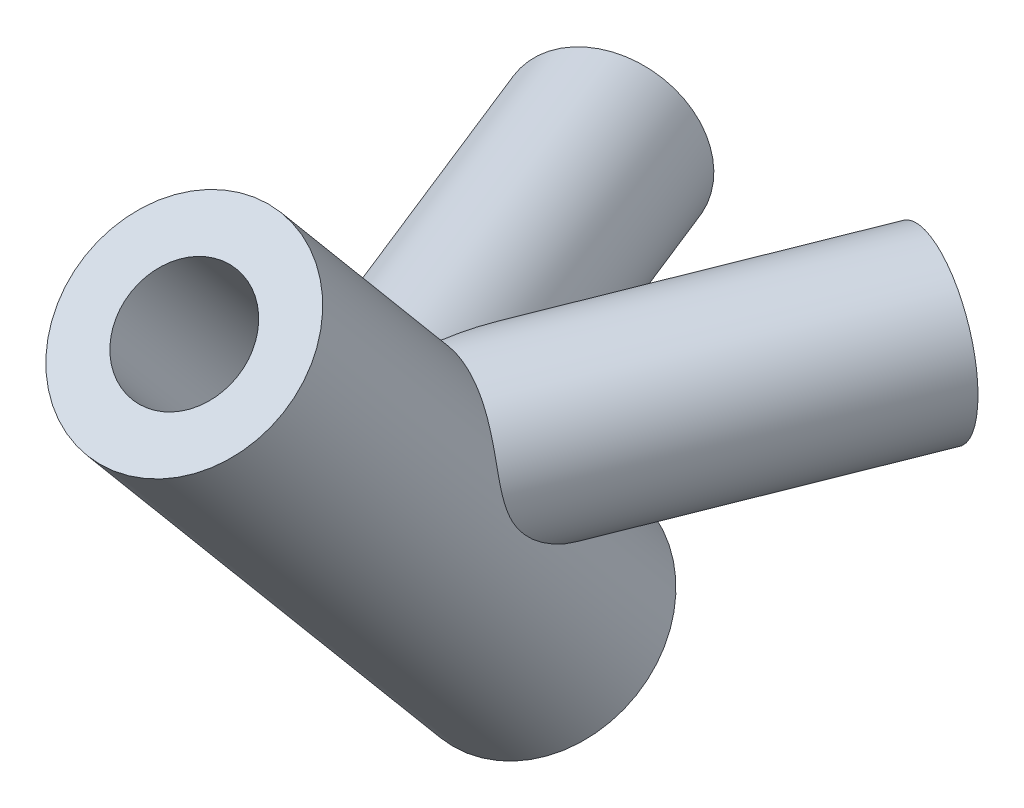
ISO-10303-21;
HEADER;
FILE_DESCRIPTION(('STEP AP214'),'2;1');
FILE_NAME('part.step','',(''),(''),'','','');
FILE_SCHEMA(('AUTOMOTIVE_DESIGN { 1 0 10303 214 1 1 1 1 }'));
ENDSEC;
DATA;
#1=APPLICATION_CONTEXT('core data for automotive mechanical design processes');
#2=APPLICATION_PROTOCOL_DEFINITION('international standard','automotive_design',2000,#1);
#3=PRODUCT_CONTEXT('',#1,'mechanical');
#4=PRODUCT('Part','Part','',(#3));
#5=PRODUCT_RELATED_PRODUCT_CATEGORY('part','',(#4));
#6=PRODUCT_DEFINITION_FORMATION('','',#4);
#7=PRODUCT_DEFINITION_CONTEXT('part definition',#1,'design');
#8=PRODUCT_DEFINITION('design','',#6,#7);
#9=PRODUCT_DEFINITION_SHAPE('','',#8);
#10=(LENGTH_UNIT() NAMED_UNIT(*) SI_UNIT(.MILLI.,.METRE.));
#11=(NAMED_UNIT(*) PLANE_ANGLE_UNIT() SI_UNIT($,.RADIAN.));
#12=(NAMED_UNIT(*) SI_UNIT($,.STERADIAN.) SOLID_ANGLE_UNIT());
#13=UNCERTAINTY_MEASURE_WITH_UNIT(LENGTH_MEASURE(1.E-05),#10,'distance_accuracy_value','');
#14=(GEOMETRIC_REPRESENTATION_CONTEXT(3) GLOBAL_UNCERTAINTY_ASSIGNED_CONTEXT((#13)) GLOBAL_UNIT_ASSIGNED_CONTEXT((#10,
#11,#12)) REPRESENTATION_CONTEXT('',''));
#15=CARTESIAN_POINT('',(0.,0.,0.));
#16=DIRECTION('',(0.,0.,1.));
#17=DIRECTION('',(1.,0.,0.));
#18=AXIS2_PLACEMENT_3D('',#15,#16,#17);
#19=CARTESIAN_POINT('',(0.,9.72876442761101,8.16340264301907));
#20=DIRECTION('',(0.,-0.766044443118977,-0.64278760968654));
#21=DIRECTION('',(0.,0.642787609686541,-0.766044443118977));
#22=AXIS2_PLACEMENT_3D('',#19,#20,#21);
#23=CYLINDRICAL_SURFACE('',#22,5.08);
#24=CARTESIAN_POINT('',(0.,9.72876442761101,8.16340264301907));
#25=DIRECTION('',(0.,0.766044443118977,0.642787609686541));
#26=DIRECTION('',(0.,-0.64278760968654,0.766044443118977));
#27=AXIS2_PLACEMENT_3D('',#24,#25,#26);
#28=CIRCLE('',#27,5.08);
#29=CARTESIAN_POINT('',(0.,6.46340337040338,12.0549084140635));
#30=VERTEX_POINT('',#29);
#31=EDGE_CURVE('E63',#30,#30,#28,.T.);
#32=ORIENTED_EDGE('',*,*,#31,.F.);
#33=EDGE_LOOP('',(#32));
#34=FACE_BOUND('',#33,.T.);
#35=CARTESIAN_POINT('',(0.,-9.72876442761101,-8.16340264301907));
#36=DIRECTION('',(0.,0.766044443118977,0.642787609686541));
#37=DIRECTION('',(0.,-0.64278760968654,0.766044443118977));
#38=AXIS2_PLACEMENT_3D('',#35,#36,#37);
#39=CIRCLE('',#38,5.08);
#40=CARTESIAN_POINT('',(0.,-12.9941254848186,-4.27189687197466));
#41=VERTEX_POINT('',#40);
#42=EDGE_CURVE('E65',#41,#41,#39,.T.);
#43=ORIENTED_EDGE('',*,*,#42,.T.);
#44=EDGE_LOOP('',(#43));
#45=FACE_BOUND('',#44,.T.);
#46=CARTESIAN_POINT('',(0.,3.56427048720662,-3.64069097857684));
#47=CARTESIAN_POINT('',(0.16761632511121,3.49764291027974,-3.6965856682746));
#48=CARTESIAN_POINT('',(0.330069031246083,3.41782441855342,-3.75266208100743));
#49=CARTESIAN_POINT('',(0.638847500080253,3.23341545850555,-3.86877450230432));
#50=CARTESIAN_POINT('',(0.785176534116976,3.12883002876736,-3.92880970370268));
#51=CARTESIAN_POINT('',(0.988139709791364,2.95524515583655,-4.02569412106894));
#52=CARTESIAN_POINT('',(1.05330680143077,2.89427116340931,-4.05930255603205));
#53=CARTESIAN_POINT('',(1.17695142475785,2.76742759324789,-4.12941566518185));
#54=CARTESIAN_POINT('',(1.23543252316153,2.7015606569407,-4.16591877740223));
#55=CARTESIAN_POINT('',(1.34476996749405,2.5658205886225,-4.24234317168568));
#56=CARTESIAN_POINT('',(1.39563889794891,2.49595433878226,-4.28225863679349));
#57=CARTESIAN_POINT('',(1.48914968269413,2.35311276567645,-4.36596982615417));
#58=CARTESIAN_POINT('',(1.53179291286081,2.28013796486168,-4.40976489969077));
#59=CARTESIAN_POINT('',(1.60389943060631,2.14091766568274,-4.49599570185458));
#60=CARTESIAN_POINT('',(1.63432332980496,2.07489134040598,-4.53798448749133));
#61=CARTESIAN_POINT('',(1.68837736605173,1.94206438963902,-4.62501673338684));
#62=CARTESIAN_POINT('',(1.71200507359926,1.87526349611197,-4.67006127892398));
#63=CARTESIAN_POINT('',(1.77288233769618,1.67474835826423,-4.80950793568409));
#64=CARTESIAN_POINT('',(1.80014024246453,1.54089349114991,-4.90824026905383));
#65=CARTESIAN_POINT('',(1.82646556799219,1.3180651135138,-5.08203990446647));
#66=CARTESIAN_POINT('',(1.8316418893075,1.22800603917018,-5.15499048875784));
#67=CARTESIAN_POINT('',(1.83236717186197,1.0502217881172,-5.3038063699623));
#68=CARTESIAN_POINT('',(1.82791168265462,0.962497709267862,-5.37967299834555));
#69=CARTESIAN_POINT('',(1.81070162388344,0.789381489991564,-5.53354989532939));
#70=CARTESIAN_POINT('',(1.79792263812685,0.703996982792391,-5.61156582183744));
#71=CARTESIAN_POINT('',(1.76522653471901,0.535689859322771,-5.76877570125691));
#72=CARTESIAN_POINT('',(1.74530649804846,0.452768264838925,-5.84797012319019));
#73=CARTESIAN_POINT('',(1.67975138334418,0.219641848444542,-6.07442627201377));
#74=CARTESIAN_POINT('',(1.62665015330616,0.0721517697367563,-6.22233208526182));
#75=CARTESIAN_POINT('',(1.50349329944941,-0.21690754858125,-6.51694579779598));
#76=CARTESIAN_POINT('',(1.43342169723442,-0.358471059846143,-6.66365243262663));
#77=CARTESIAN_POINT('',(1.27846382255,-0.637306922676255,-6.95365363937045));
#78=CARTESIAN_POINT('',(1.19355880943171,-0.774573583736182,-7.09694363124561));
#79=CARTESIAN_POINT('',(1.01005107923469,-1.04570704711363,-7.37767874578381));
#80=CARTESIAN_POINT('',(0.911456588659131,-1.17957583461177,-7.51512731445784));
#81=CARTESIAN_POINT('',(0.729603983356677,-1.40827845566384,-7.74518098992566));
#82=CARTESIAN_POINT('',(0.649575286152909,-1.503731332992,-7.83973084152228));
#83=CARTESIAN_POINT('',(0.482143562179067,-1.69339276195728,-8.0233750684913));
#84=CARTESIAN_POINT('',(0.394742158131474,-1.78760158215761,-8.11247063693241));
#85=CARTESIAN_POINT('',(0.212422708440739,-1.97453190920489,-8.28356812790652));
#86=CARTESIAN_POINT('',(0.117525496692644,-2.06725673297127,-8.36558847247321));
#87=CARTESIAN_POINT('',(-0.0804530086145272,-2.2512020550591,-8.52087847155734));
#88=CARTESIAN_POINT('',(-0.183529329466784,-2.34242342731016,-8.59415337625373));
#89=CARTESIAN_POINT('',(-0.412572935215546,-2.53469277416725,-8.73833682526642));
#90=CARTESIAN_POINT('',(-0.539771767505752,-2.63546852610447,-8.80768702306375));
#91=CARTESIAN_POINT('',(-0.806183430585438,-2.83290434906498,-8.92686416309001));
#92=CARTESIAN_POINT('',(-0.945386248335596,-2.92956775175347,-8.97670718848602));
#93=CARTESIAN_POINT('',(-1.20233201878175,-3.09442865518352,-9.04132264152199));
#94=CARTESIAN_POINT('',(-1.31773357409339,-3.16409220129734,-9.06149951656311));
#95=CARTESIAN_POINT('',(-1.55407370438321,-3.29668453652411,-9.081820557187));
#96=CARTESIAN_POINT('',(-1.67500229690182,-3.35962483173114,-9.08199951407757));
#97=CARTESIAN_POINT('',(-1.89856707875977,-3.46584435181048,-9.06074283176162));
#98=CARTESIAN_POINT('',(-2.00081593861562,-3.51064681588807,-9.04297858020276));
#99=CARTESIAN_POINT('',(-2.20425958046213,-3.5916926588718,-8.99022899195637));
#100=CARTESIAN_POINT('',(-2.30545500515478,-3.62794158919032,-8.95525487054963));
#101=CARTESIAN_POINT('',(-2.50373932718494,-3.69063278397929,-8.86877054008669));
#102=CARTESIAN_POINT('',(-2.60082743221682,-3.71707316394485,-8.81725715690511));
#103=CARTESIAN_POINT('',(-2.78838270731828,-3.75986014751547,-8.6999748238019));
#104=CARTESIAN_POINT('',(-2.87884431560533,-3.77619835578513,-8.63419407824511));
#105=CARTESIAN_POINT('',(-3.07883517194429,-3.80298390695502,-8.46898667451247));
#106=CARTESIAN_POINT('',(-3.18543564672345,-3.80997198026477,-8.36548028072927));
#107=CARTESIAN_POINT('',(-3.38429476021183,-3.81002801152785,-8.14551217233178));
#108=CARTESIAN_POINT('',(-3.47652241844272,-3.80306633626894,-8.02902337584711));
#109=CARTESIAN_POINT('',(-3.6302917969438,-3.78039197044922,-7.81257093669015));
#110=CARTESIAN_POINT('',(-3.69425921960649,-3.7667476166123,-7.71406637317918));
#111=CARTESIAN_POINT('',(-3.81470896546287,-3.73334652056141,-7.51353035917504));
#112=CARTESIAN_POINT('',(-3.87118655308791,-3.71358593733501,-7.41149672828301));
#113=CARTESIAN_POINT('',(-3.97756389927971,-3.66878007804198,-7.20496642212007));
#114=CARTESIAN_POINT('',(-4.02745071593383,-3.64372464828299,-7.10046536218049));
#115=CARTESIAN_POINT('',(-4.12131176994363,-3.58900134010067,-6.8900083845094));
#116=CARTESIAN_POINT('',(-4.16528381258804,-3.55933175832584,-6.78405194273405));
#117=CARTESIAN_POINT('',(-4.28157547962851,-3.47012914024063,-6.48498216187388));
#118=CARTESIAN_POINT('',(-4.34793228647167,-3.40590448482839,-6.29093619784359));
#119=CARTESIAN_POINT('',(-4.46675151442775,-3.26578340185544,-5.90274074810358));
#120=CARTESIAN_POINT('',(-4.51920150220136,-3.18987662510382,-5.70859132421863));
#121=CARTESIAN_POINT('',(-4.61263644638605,-3.02700383697113,-5.32183808153621));
#122=CARTESIAN_POINT('',(-4.6536034449995,-2.94002080937342,-5.12923713613935));
#123=CARTESIAN_POINT('',(-4.72578153219212,-2.7549872572948,-4.7476779823904));
#124=CARTESIAN_POINT('',(-4.75699779101735,-2.65694263579945,-4.55871789355216));
#125=CARTESIAN_POINT('',(-4.80336657358479,-2.47840683898259,-4.23942713386699));
#126=CARTESIAN_POINT('',(-4.82056183063545,-2.40087417811644,-4.10773225400612));
#127=CARTESIAN_POINT('',(-4.85105538102364,-2.23891904367587,-3.84812784533511));
#128=CARTESIAN_POINT('',(-4.86435303075764,-2.15449543515331,-3.72021894482707));
#129=CARTESIAN_POINT('',(-4.88727740061571,-1.9780662202424,-3.46983850758317));
#130=CARTESIAN_POINT('',(-4.89691342972405,-1.88608057382607,-3.347353891382));
#131=CARTESIAN_POINT('',(-4.9126437687274,-1.69326435045888,-3.10940901070616));
#132=CARTESIAN_POINT('',(-4.91874009041954,-1.59243883524038,-2.99394478965768));
#133=CARTESIAN_POINT('',(-4.92826080496291,-1.35564077366609,-2.74649430605385));
#134=CARTESIAN_POINT('',(-4.93072563195682,-1.21696576724277,-2.61696780549873));
#135=CARTESIAN_POINT('',(-4.92935110948138,-0.996141023174749,-2.43884254340127));
#136=CARTESIAN_POINT('',(-4.92804974202792,-0.920442404730753,-2.38218817432902));
#137=CARTESIAN_POINT('',(-4.9234794196721,-0.764763819443768,-2.27521334926329));
#138=CARTESIAN_POINT('',(-4.9202108468772,-0.68478468679032,-2.22489166551164));
#139=CARTESIAN_POINT('',(-4.90824679189373,-0.462961735496123,-2.09874675279465));
#140=CARTESIAN_POINT('',(-4.89735156819058,-0.317152373019538,-2.02986440334737));
#141=CARTESIAN_POINT('',(-4.86667772606281,-0.017052339324615,-1.91718872655812));
#142=CARTESIAN_POINT('',(-4.84690232985261,0.137235237725805,-1.87338631194232));
#143=CARTESIAN_POINT('',(-4.79626238730912,0.448795351261694,-1.81115377013919));
#144=CARTESIAN_POINT('',(-4.76541238272529,0.606063718448969,-1.79269052344007));
#145=CARTESIAN_POINT('',(-4.69089087439187,0.918622131710084,-1.77800921590877));
#146=CARTESIAN_POINT('',(-4.64720559019626,1.07390986335394,-1.78181514761821));
#147=CARTESIAN_POINT('',(-4.54308052858457,1.38700343243921,-1.80796560547416));
#148=CARTESIAN_POINT('',(-4.48182590512547,1.54444598019484,-1.83135719434491));
#149=CARTESIAN_POINT('',(-4.34327885878129,1.84901149204575,-1.89286960547418));
#150=CARTESIAN_POINT('',(-4.26598137328711,1.99613117892232,-1.93099508055306));
#151=CARTESIAN_POINT('',(-4.07968891079128,2.30326057977057,-2.02555856913115));
#152=CARTESIAN_POINT('',(-3.96748098403281,2.46069108490056,-2.08407218026218));
#153=CARTESIAN_POINT('',(-3.72145996680467,2.7538359287717,-2.2099155470816));
#154=CARTESIAN_POINT('',(-3.58763731869919,2.88954060764712,-2.27724920033094));
#155=CARTESIAN_POINT('',(-3.36766592207544,3.07828632281304,-2.38376156911835));
#156=CARTESIAN_POINT('',(-3.28838257184971,3.14036756007629,-2.42142912789593));
#157=CARTESIAN_POINT('',(-3.12474299527782,3.25694359467775,-2.49744906576059));
#158=CARTESIAN_POINT('',(-3.04038847974719,3.3114409301925,-2.5358012108587));
#159=CARTESIAN_POINT('',(-2.86709093839297,3.41246052304508,-2.6127141366689));
#160=CARTESIAN_POINT('',(-2.77814658917365,3.45898046334104,-2.6512749746526));
#161=CARTESIAN_POINT('',(-2.59631783592292,3.5436642826665,-2.72816995810564));
#162=CARTESIAN_POINT('',(-2.50343502168504,3.58183149572439,-2.76650418805981));
#163=CARTESIAN_POINT('',(-2.31561273156805,3.64909648083487,-2.84211829483337));
#164=CARTESIAN_POINT('',(-2.22071672425418,3.67830756354377,-2.87940541100555));
#165=CARTESIAN_POINT('',(-2.02843054070856,3.72811783822952,-2.95318013229806));
#166=CARTESIAN_POINT('',(-1.93104130245711,3.74872021979725,-2.98966802877896));
#167=CARTESIAN_POINT('',(-1.73441567525173,3.78119768529318,-3.06170664285949));
#168=CARTESIAN_POINT('',(-1.63517829699291,3.7930679487317,-3.09725683238213));
#169=CARTESIAN_POINT('',(-1.43571307603345,3.80798905525713,-3.16729913955075));
#170=CARTESIAN_POINT('',(-1.33548557808068,3.81104286656592,-3.20179160942739));
#171=CARTESIAN_POINT('',(-1.13018728936775,3.80826972090689,-3.27129412439319));
#172=CARTESIAN_POINT('',(-1.02510534418775,3.80202871880067,-3.30625526170876));
#173=CARTESIAN_POINT('',(-0.815653840396229,3.77996478417284,-3.37513970341342));
#174=CARTESIAN_POINT('',(-0.711284052235908,3.76414510252511,-3.40906335580921));
#175=CARTESIAN_POINT('',(-0.50414650809748,3.72304237478817,-3.47613286943978));
#176=CARTESIAN_POINT('',(-0.401378994549176,3.69775791084363,-3.50927861335035));
#177=CARTESIAN_POINT('',(-0.198481936467768,3.63791887221502,-3.57515900746108));
#178=CARTESIAN_POINT('',(-0.0983520568730617,3.60336548127046,-3.60789370959717));
#179=CARTESIAN_POINT('',(0.,3.56427048720662,-3.64069097857684));
#180=B_SPLINE_CURVE_WITH_KNOTS('',3,(#46,#47,#48,#49,#50,#51,#52,#53,#54,#55,#56,#57,#58,#59,
#60,#61,#62,#63,#64,#65,#66,#67,#68,#69,#70,#71,#72,#73,#74,#75,#76,#77,#78,#79,#80,#81,#82,#83,
#84,#85,#86,#87,#88,#89,#90,#91,#92,#93,#94,#95,#96,#97,#98,#99,#100,#101,#102,#103,#104,#105,
#106,#107,#108,#109,#110,#111,#112,#113,#114,#115,#116,#117,#118,#119,#120,#121,#122,#123,#124,
#125,#126,#127,#128,#129,#130,#131,#132,#133,#134,#135,#136,#137,#138,#139,#140,#141,#142,#143,
#144,#145,#146,#147,#148,#149,#150,#151,#152,#153,#154,#155,#156,#157,#158,#159,#160,#161,#162,
#163,#164,#165,#166,#167,#168,#169,#170,#171,#172,#173,#174,#175,#176,#177,#178,#179),
.UNSPECIFIED.,.T.,.F.,(4,2,2,2,2,2,2,2,2,2,2,2,2,2,2,2,2,2,2,2,2,2,2,2,2,2,2,2,2,2,2,2,2,2,2,2,
2,2,2,2,2,2,2,2,2,2,2,2,2,2,2,2,2,2,2,2,2,2,2,2,2,2,2,2,2,2,4),(0.,0.566202143962359,
1.13228919862481,1.41804266523583,1.70364297514943,1.9887657833072,2.27384085880712,
2.52535520819528,2.77695935743235,3.28006134716035,3.62767586045955,3.9754510258445,
4.32425097946361,4.67319367354898,5.31871224614298,5.96484098372955,6.6117920280634,
7.25835596529789,7.72726931941327,8.19607973430549,8.66363012432426,9.13089840116587,
9.65918097859601,10.1870270782853,10.5945503099163,11.0013645433801,11.3389811329889,
11.676377996343,12.0138396498162,12.3515813727028,12.7953458871295,13.2400540822836,
13.594294623248,13.9487580813833,14.3039075488012,14.659188435097,15.3028612709894,
15.947107654391,16.5923559987357,17.2372616226073,17.6984099955537,18.1596344740964,
18.6196784033491,19.0794606094732,19.6468754801572,19.9302723700682,20.213614231087,
20.696139389078,21.1784896017354,21.6602087570894,22.1424470062912,22.6522455095038,
23.1622051339333,23.7656265974852,24.3693156171795,24.6915207447949,25.0136177762705,
25.335808203253,25.6578697909726,25.9756704051936,26.2933531671787,26.6112111718257,
26.9289621512028,27.2612973481539,27.5935198182192,27.9257920762263,28.2580219197555),.UNSPECIFIED.);
#181=CARTESIAN_POINT('',(0.,-2.1763987439394,-8.45768441314223));
#182=VERTEX_POINT('',#181);
#183=CARTESIAN_POINT('',(0.,3.56427048720662,-3.64069097857684));
#184=VERTEX_POINT('',#183);
#185=EDGE_CURVE('E47',#182,#184,#180,.T.);
#186=ORIENTED_EDGE('',*,*,#185,.F.);
#187=CARTESIAN_POINT('',(0.,3.56427048720662,-3.64069097857684));
#188=CARTESIAN_POINT('',(-0.16761632511121,3.49764291027974,-3.6965856682746));
#189=CARTESIAN_POINT('',(-0.330069031246083,3.41782441855342,-3.75266208100743));
#190=CARTESIAN_POINT('',(-0.638847500080253,3.23341545850555,-3.86877450230432));
#191=CARTESIAN_POINT('',(-0.785176534116976,3.12883002876736,-3.92880970370268));
#192=CARTESIAN_POINT('',(-0.988139709791364,2.95524515583655,-4.02569412106894));
#193=CARTESIAN_POINT('',(-1.05330680143077,2.89427116340931,-4.05930255603205));
#194=CARTESIAN_POINT('',(-1.17695142475785,2.76742759324789,-4.12941566518185));
#195=CARTESIAN_POINT('',(-1.23543252316153,2.7015606569407,-4.16591877740223));
#196=CARTESIAN_POINT('',(-1.34476996749405,2.5658205886225,-4.24234317168568));
#197=CARTESIAN_POINT('',(-1.39563889794891,2.49595433878226,-4.28225863679349));
#198=CARTESIAN_POINT('',(-1.48914968269413,2.35311276567645,-4.36596982615417));
#199=CARTESIAN_POINT('',(-1.53179291286081,2.28013796486168,-4.40976489969077));
#200=CARTESIAN_POINT('',(-1.60389943060631,2.14091766568274,-4.49599570185458));
#201=CARTESIAN_POINT('',(-1.63432332980496,2.07489134040598,-4.53798448749133));
#202=CARTESIAN_POINT('',(-1.68837736605173,1.94206438963902,-4.62501673338684));
#203=CARTESIAN_POINT('',(-1.71200507359926,1.87526349611197,-4.67006127892398));
#204=CARTESIAN_POINT('',(-1.77288233769618,1.67474835826423,-4.80950793568409));
#205=CARTESIAN_POINT('',(-1.80014024246453,1.54089349114991,-4.90824026905383));
#206=CARTESIAN_POINT('',(-1.82646556799219,1.3180651135138,-5.08203990446647));
#207=CARTESIAN_POINT('',(-1.8316418893075,1.22800603917018,-5.15499048875784));
#208=CARTESIAN_POINT('',(-1.83236717186197,1.0502217881172,-5.3038063699623));
#209=CARTESIAN_POINT('',(-1.82791168265462,0.962497709267862,-5.37967299834555));
#210=CARTESIAN_POINT('',(-1.81070162388344,0.789381489991564,-5.53354989532939));
#211=CARTESIAN_POINT('',(-1.79792263812685,0.703996982792391,-5.61156582183744));
#212=CARTESIAN_POINT('',(-1.76522653471901,0.535689859322771,-5.76877570125691));
#213=CARTESIAN_POINT('',(-1.74530649804846,0.452768264838925,-5.84797012319019));
#214=CARTESIAN_POINT('',(-1.67975138334418,0.219641848444542,-6.07442627201377));
#215=CARTESIAN_POINT('',(-1.62665015330616,0.0721517697367563,-6.22233208526182));
#216=CARTESIAN_POINT('',(-1.50349329944941,-0.21690754858125,-6.51694579779598));
#217=CARTESIAN_POINT('',(-1.43342169723442,-0.358471059846143,-6.66365243262663));
#218=CARTESIAN_POINT('',(-1.27846382255,-0.637306922676255,-6.95365363937045));
#219=CARTESIAN_POINT('',(-1.19355880943171,-0.774573583736182,-7.09694363124561));
#220=CARTESIAN_POINT('',(-1.01005107923469,-1.04570704711363,-7.37767874578381));
#221=CARTESIAN_POINT('',(-0.911456588659131,-1.17957583461177,-7.51512731445784));
#222=CARTESIAN_POINT('',(-0.729603983356677,-1.40827845566384,-7.74518098992566));
#223=CARTESIAN_POINT('',(-0.649575286152909,-1.503731332992,-7.83973084152228));
#224=CARTESIAN_POINT('',(-0.482143562179067,-1.69339276195728,-8.0233750684913));
#225=CARTESIAN_POINT('',(-0.394742158131474,-1.78760158215761,-8.11247063693241));
#226=CARTESIAN_POINT('',(-0.212422708440739,-1.97453190920489,-8.28356812790652));
#227=CARTESIAN_POINT('',(-0.117525496692644,-2.06725673297127,-8.36558847247321));
#228=CARTESIAN_POINT('',(0.0804530086145272,-2.2512020550591,-8.52087847155734));
#229=CARTESIAN_POINT('',(0.183529329466784,-2.34242342731016,-8.59415337625373));
#230=CARTESIAN_POINT('',(0.412572935215546,-2.53469277416725,-8.73833682526642));
#231=CARTESIAN_POINT('',(0.539771767505752,-2.63546852610447,-8.80768702306375));
#232=CARTESIAN_POINT('',(0.806183430585438,-2.83290434906498,-8.92686416309001));
#233=CARTESIAN_POINT('',(0.945386248335596,-2.92956775175347,-8.97670718848602));
#234=CARTESIAN_POINT('',(1.20233201878175,-3.09442865518352,-9.04132264152199));
#235=CARTESIAN_POINT('',(1.31773357409339,-3.16409220129734,-9.06149951656311));
#236=CARTESIAN_POINT('',(1.55407370438321,-3.29668453652411,-9.081820557187));
#237=CARTESIAN_POINT('',(1.67500229690182,-3.35962483173114,-9.08199951407757));
#238=CARTESIAN_POINT('',(1.89856707875977,-3.46584435181048,-9.06074283176162));
#239=CARTESIAN_POINT('',(2.00081593861562,-3.51064681588807,-9.04297858020276));
#240=CARTESIAN_POINT('',(2.20425958046213,-3.5916926588718,-8.99022899195637));
#241=CARTESIAN_POINT('',(2.30545500515478,-3.62794158919032,-8.95525487054963));
#242=CARTESIAN_POINT('',(2.50373932718494,-3.69063278397929,-8.86877054008669));
#243=CARTESIAN_POINT('',(2.60082743221682,-3.71707316394485,-8.81725715690511));
#244=CARTESIAN_POINT('',(2.78838270731828,-3.75986014751547,-8.6999748238019));
#245=CARTESIAN_POINT('',(2.87884431560533,-3.77619835578513,-8.63419407824511));
#246=CARTESIAN_POINT('',(3.07883517194429,-3.80298390695502,-8.46898667451247));
#247=CARTESIAN_POINT('',(3.18543564672345,-3.80997198026477,-8.36548028072927));
#248=CARTESIAN_POINT('',(3.38429476021183,-3.81002801152785,-8.14551217233178));
#249=CARTESIAN_POINT('',(3.47652241844272,-3.80306633626894,-8.02902337584711));
#250=CARTESIAN_POINT('',(3.6302917969438,-3.78039197044922,-7.81257093669015));
#251=CARTESIAN_POINT('',(3.69425921960649,-3.7667476166123,-7.71406637317918));
#252=CARTESIAN_POINT('',(3.81470896546287,-3.73334652056141,-7.51353035917504));
#253=CARTESIAN_POINT('',(3.87118655308791,-3.71358593733501,-7.41149672828301));
#254=CARTESIAN_POINT('',(3.97756389927971,-3.66878007804198,-7.20496642212007));
#255=CARTESIAN_POINT('',(4.02745071593383,-3.64372464828299,-7.10046536218049));
#256=CARTESIAN_POINT('',(4.12131176994363,-3.58900134010067,-6.8900083845094));
#257=CARTESIAN_POINT('',(4.16528381258804,-3.55933175832584,-6.78405194273405));
#258=CARTESIAN_POINT('',(4.28157547962851,-3.47012914024063,-6.48498216187388));
#259=CARTESIAN_POINT('',(4.34793228647167,-3.40590448482839,-6.29093619784359));
#260=CARTESIAN_POINT('',(4.46675151442775,-3.26578340185544,-5.90274074810358));
#261=CARTESIAN_POINT('',(4.51920150220136,-3.18987662510382,-5.70859132421863));
#262=CARTESIAN_POINT('',(4.61263644638605,-3.02700383697113,-5.32183808153621));
#263=CARTESIAN_POINT('',(4.6536034449995,-2.94002080937342,-5.12923713613935));
#264=CARTESIAN_POINT('',(4.72578153219212,-2.7549872572948,-4.7476779823904));
#265=CARTESIAN_POINT('',(4.75699779101735,-2.65694263579945,-4.55871789355216));
#266=CARTESIAN_POINT('',(4.80336657358479,-2.47840683898259,-4.23942713386699));
#267=CARTESIAN_POINT('',(4.82056183063545,-2.40087417811644,-4.10773225400612));
#268=CARTESIAN_POINT('',(4.85105538102364,-2.23891904367587,-3.84812784533511));
#269=CARTESIAN_POINT('',(4.86435303075764,-2.15449543515331,-3.72021894482707));
#270=CARTESIAN_POINT('',(4.88727740061571,-1.9780662202424,-3.46983850758317));
#271=CARTESIAN_POINT('',(4.89691342972405,-1.88608057382607,-3.347353891382));
#272=CARTESIAN_POINT('',(4.9126437687274,-1.69326435045888,-3.10940901070616));
#273=CARTESIAN_POINT('',(4.91874009041954,-1.59243883524038,-2.99394478965768));
#274=CARTESIAN_POINT('',(4.92826080496291,-1.35564077366609,-2.74649430605385));
#275=CARTESIAN_POINT('',(4.93072563195682,-1.21696576724277,-2.61696780549873));
#276=CARTESIAN_POINT('',(4.92935110948138,-0.996141023174749,-2.43884254340127));
#277=CARTESIAN_POINT('',(4.92804974202792,-0.920442404730753,-2.38218817432902));
#278=CARTESIAN_POINT('',(4.9234794196721,-0.764763819443768,-2.27521334926329));
#279=CARTESIAN_POINT('',(4.9202108468772,-0.68478468679032,-2.22489166551164));
#280=CARTESIAN_POINT('',(4.90824679189373,-0.462961735496123,-2.09874675279465));
#281=CARTESIAN_POINT('',(4.89735156819058,-0.317152373019538,-2.02986440334737));
#282=CARTESIAN_POINT('',(4.86667772606281,-0.017052339324615,-1.91718872655812));
#283=CARTESIAN_POINT('',(4.84690232985261,0.137235237725805,-1.87338631194232));
#284=CARTESIAN_POINT('',(4.79626238730912,0.448795351261694,-1.81115377013919));
#285=CARTESIAN_POINT('',(4.76541238272529,0.606063718448969,-1.79269052344007));
#286=CARTESIAN_POINT('',(4.69089087439187,0.918622131710084,-1.77800921590877));
#287=CARTESIAN_POINT('',(4.64720559019626,1.07390986335394,-1.78181514761821));
#288=CARTESIAN_POINT('',(4.54308052858457,1.38700343243921,-1.80796560547416));
#289=CARTESIAN_POINT('',(4.48182590512547,1.54444598019484,-1.83135719434491));
#290=CARTESIAN_POINT('',(4.34327885878129,1.84901149204575,-1.89286960547418));
#291=CARTESIAN_POINT('',(4.26598137328711,1.99613117892232,-1.93099508055306));
#292=CARTESIAN_POINT('',(4.07968891079128,2.30326057977057,-2.02555856913115));
#293=CARTESIAN_POINT('',(3.96748098403281,2.46069108490056,-2.08407218026218));
#294=CARTESIAN_POINT('',(3.72145996680467,2.7538359287717,-2.2099155470816));
#295=CARTESIAN_POINT('',(3.58763731869919,2.88954060764712,-2.27724920033094));
#296=CARTESIAN_POINT('',(3.36766592207544,3.07828632281304,-2.38376156911835));
#297=CARTESIAN_POINT('',(3.28838257184971,3.14036756007629,-2.42142912789593));
#298=CARTESIAN_POINT('',(3.12474299527782,3.25694359467775,-2.49744906576059));
#299=CARTESIAN_POINT('',(3.04038847974719,3.3114409301925,-2.5358012108587));
#300=CARTESIAN_POINT('',(2.86709093839297,3.41246052304508,-2.6127141366689));
#301=CARTESIAN_POINT('',(2.77814658917365,3.45898046334104,-2.6512749746526));
#302=CARTESIAN_POINT('',(2.59631783592292,3.5436642826665,-2.72816995810564));
#303=CARTESIAN_POINT('',(2.50343502168504,3.58183149572439,-2.76650418805981));
#304=CARTESIAN_POINT('',(2.31561273156805,3.64909648083487,-2.84211829483337));
#305=CARTESIAN_POINT('',(2.22071672425418,3.67830756354377,-2.87940541100555));
#306=CARTESIAN_POINT('',(2.02843054070856,3.72811783822952,-2.95318013229806));
#307=CARTESIAN_POINT('',(1.93104130245711,3.74872021979725,-2.98966802877896));
#308=CARTESIAN_POINT('',(1.73441567525173,3.78119768529318,-3.06170664285949));
#309=CARTESIAN_POINT('',(1.63517829699291,3.7930679487317,-3.09725683238213));
#310=CARTESIAN_POINT('',(1.43571307603345,3.80798905525713,-3.16729913955075));
#311=CARTESIAN_POINT('',(1.33548557808068,3.81104286656592,-3.20179160942739));
#312=CARTESIAN_POINT('',(1.13018728936775,3.80826972090689,-3.27129412439319));
#313=CARTESIAN_POINT('',(1.02510534418775,3.80202871880067,-3.30625526170876));
#314=CARTESIAN_POINT('',(0.815653840396229,3.77996478417284,-3.37513970341342));
#315=CARTESIAN_POINT('',(0.711284052235908,3.76414510252511,-3.40906335580921));
#316=CARTESIAN_POINT('',(0.50414650809748,3.72304237478817,-3.47613286943978));
#317=CARTESIAN_POINT('',(0.401378994549176,3.69775791084363,-3.50927861335035));
#318=CARTESIAN_POINT('',(0.198481936467768,3.63791887221502,-3.57515900746108));
#319=CARTESIAN_POINT('',(0.0983520568730617,3.60336548127046,-3.60789370959717));
#320=CARTESIAN_POINT('',(0.,3.56427048720662,-3.64069097857684));
#321=B_SPLINE_CURVE_WITH_KNOTS('',3,(#187,#188,#189,#190,#191,#192,#193,#194,#195,#196,#197,
#198,#199,#200,#201,#202,#203,#204,#205,#206,#207,#208,#209,#210,#211,#212,#213,#214,#215,#216,
#217,#218,#219,#220,#221,#222,#223,#224,#225,#226,#227,#228,#229,#230,#231,#232,#233,#234,#235,
#236,#237,#238,#239,#240,#241,#242,#243,#244,#245,#246,#247,#248,#249,#250,#251,#252,#253,#254,
#255,#256,#257,#258,#259,#260,#261,#262,#263,#264,#265,#266,#267,#268,#269,#270,#271,#272,#273,
#274,#275,#276,#277,#278,#279,#280,#281,#282,#283,#284,#285,#286,#287,#288,#289,#290,#291,#292,
#293,#294,#295,#296,#297,#298,#299,#300,#301,#302,#303,#304,#305,#306,#307,#308,#309,#310,#311,
#312,#313,#314,#315,#316,#317,#318,#319,#320),.UNSPECIFIED.,.T.,.F.,(4,2,2,2,2,2,2,2,2,2,2,2,2,
2,2,2,2,2,2,2,2,2,2,2,2,2,2,2,2,2,2,2,2,2,2,2,2,2,2,2,2,2,2,2,2,2,2,2,2,2,2,2,2,2,2,2,2,2,2,2,2,
2,2,2,2,2,4),(0.,0.566202143962359,1.13228919862481,1.41804266523583,1.70364297514943,
1.9887657833072,2.27384085880712,2.52535520819528,2.77695935743235,3.28006134716035,
3.62767586045955,3.9754510258445,4.32425097946361,4.67319367354898,5.31871224614298,
5.96484098372955,6.6117920280634,7.25835596529789,7.72726931941327,8.19607973430549,
8.66363012432426,9.13089840116587,9.65918097859601,10.1870270782853,10.5945503099163,
11.0013645433801,11.3389811329889,11.676377996343,12.0138396498162,12.3515813727028,
12.7953458871295,13.2400540822836,13.594294623248,13.9487580813833,14.3039075488012,
14.659188435097,15.3028612709894,15.947107654391,16.5923559987357,17.2372616226073,
17.6984099955537,18.1596344740964,18.6196784033491,19.0794606094732,19.6468754801572,
19.9302723700682,20.213614231087,20.696139389078,21.1784896017354,21.6602087570894,
22.1424470062912,22.6522455095038,23.1622051339333,23.7656265974852,24.3693156171795,
24.6915207447949,25.0136177762705,25.335808203253,25.6578697909726,25.9756704051936,
26.2933531671787,26.6112111718257,26.9289621512028,27.2612973481539,27.5935198182192,
27.9257920762263,28.2580219197555),.UNSPECIFIED.);
#322=EDGE_CURVE('E53',#182,#184,#321,.T.);
#323=ORIENTED_EDGE('',*,*,#322,.T.);
#324=EDGE_LOOP('',(#186,#323));
#325=FACE_BOUND('',#324,.T.);
#326=ADVANCED_FACE('F39',(#34,#45,#325),#23,.T.);
#327=CARTESIAN_POINT('',(0.,9.72876442761101,8.16340264301907));
#328=DIRECTION('',(0.,0.766044443118977,0.642787609686541));
#329=DIRECTION('',(0.,-0.64278760968654,0.766044443118977));
#330=AXIS2_PLACEMENT_3D('',#327,#328,#329);
#331=PLANE('',#330);
#332=CARTESIAN_POINT('',(0.,9.72876442761101,8.16340264301907));
#333=DIRECTION('',(0.,0.766044443118977,0.642787609686541));
#334=DIRECTION('',(0.,-0.64278760968654,0.766044443118977));
#335=AXIS2_PLACEMENT_3D('',#332,#333,#334);
#336=CIRCLE('',#335,2.7305);
#337=CARTESIAN_POINT('',(0.,7.97363285936191,10.2550869949554));
#338=VERTEX_POINT('',#337);
#339=EDGE_CURVE('E200',#338,#338,#336,.F.);
#340=ORIENTED_EDGE('',*,*,#339,.T.);
#341=EDGE_LOOP('',(#340));
#342=FACE_BOUND('',#341,.T.);
#343=ORIENTED_EDGE('',*,*,#31,.T.);
#344=EDGE_LOOP('',(#343));
#345=FACE_BOUND('',#344,.T.);
#346=ADVANCED_FACE('F80',(#342,#345),#331,.T.);
#347=CARTESIAN_POINT('',(0.,-9.72876442761101,-8.16340264301907));
#348=DIRECTION('',(0.,0.766044443118977,0.642787609686541));
#349=DIRECTION('',(0.,-0.64278760968654,0.766044443118977));
#350=AXIS2_PLACEMENT_3D('',#347,#348,#349);
#351=PLANE('',#350);
#352=CARTESIAN_POINT('',(0.,-9.72876442761101,-8.16340264301907));
#353=DIRECTION('',(0.,-0.766044443118977,-0.64278760968654));
#354=DIRECTION('',(0.,0.64278760968654,-0.766044443118977));
#355=AXIS2_PLACEMENT_3D('',#352,#353,#354);
#356=CIRCLE('',#355,2.7305);
#357=CARTESIAN_POINT('',(0.,-7.97363285936191,-10.2550869949554));
#358=VERTEX_POINT('',#357);
#359=EDGE_CURVE('E202',#358,#358,#356,.T.);
#360=ORIENTED_EDGE('',*,*,#359,.F.);
#361=EDGE_LOOP('',(#360));
#362=FACE_BOUND('',#361,.T.);
#363=ORIENTED_EDGE('',*,*,#42,.F.);
#364=EDGE_LOOP('',(#363));
#365=FACE_BOUND('',#364,.T.);
#366=ADVANCED_FACE('F77',(#362,#365),#351,.F.);
#367=CARTESIAN_POINT('',(-7.51325410780416,0.,-18.879973853572));
#368=DIRECTION('',(0.369746757273827,0.,0.929132571534057));
#369=DIRECTION('',(0.929132571534057,0.,-0.369746757273827));
#370=AXIS2_PLACEMENT_3D('',#367,#368,#369);
#371=CYLINDRICAL_SURFACE('',#370,3.81);
#372=CARTESIAN_POINT('',(-7.51325410780416,0.,-18.879973853572));
#373=DIRECTION('',(-0.369746757273827,0.,-0.929132571534057));
#374=DIRECTION('',(-0.929132571534057,0.,0.369746757273827));
#375=AXIS2_PLACEMENT_3D('',#372,#373,#374);
#376=CIRCLE('',#375,3.81);
#377=CARTESIAN_POINT('',(-11.0532492053489,0.,-17.4712387083588));
#378=VERTEX_POINT('',#377);
#379=EDGE_CURVE('E99',#378,#378,#376,.T.);
#380=ORIENTED_EDGE('',*,*,#379,.F.);
#381=EDGE_LOOP('',(#380));
#382=FACE_BOUND('',#381,.T.);
#383=ORIENTED_EDGE('',*,*,#185,.T.);
#384=CARTESIAN_POINT('',(0.,0.,0.));
#385=DIRECTION('',(1.,0.,0.));
#386=DIRECTION('',(0.,0.,1.));
#387=AXIS2_PLACEMENT_3D('',#384,#385,#386);
#388=ELLIPSE('',#387,10.3043500045584,3.81);
#389=EDGE_CURVE('E11',#184,#182,#388,.F.);
#390=ORIENTED_EDGE('',*,*,#389,.T.);
#391=EDGE_LOOP('',(#383,#390));
#392=FACE_BOUND('',#391,.T.);
#393=ADVANCED_FACE('F62',(#382,#392),#371,.T.);
#394=CARTESIAN_POINT('',(-7.51325410780416,0.,-18.879973853572));
#395=DIRECTION('',(-0.369746757273827,0.,-0.929132571534057));
#396=DIRECTION('',(-0.929132571534057,0.,0.369746757273827));
#397=AXIS2_PLACEMENT_3D('',#394,#395,#396);
#398=PLANE('',#397);
#399=CARTESIAN_POINT('',(-7.51325410780416,0.,-18.8799738535721));
#400=DIRECTION('',(-0.369746757273827,0.,-0.929132571534057));
#401=DIRECTION('',(-0.929132571534057,0.,0.369746757273827));
#402=AXIS2_PLACEMENT_3D('',#399,#400,#401);
#403=CIRCLE('',#402,2.7305);
#404=CARTESIAN_POINT('',(-10.0502505943779,0.,-17.8703803328359));
#405=VERTEX_POINT('',#404);
#406=EDGE_CURVE('E59',#405,#405,#403,.T.);
#407=ORIENTED_EDGE('',*,*,#406,.F.);
#408=EDGE_LOOP('',(#407));
#409=FACE_BOUND('',#408,.T.);
#410=ORIENTED_EDGE('',*,*,#379,.T.);
#411=EDGE_LOOP('',(#410));
#412=FACE_BOUND('',#411,.T.);
#413=ADVANCED_FACE('F76',(#409,#412),#398,.T.);
#414=CARTESIAN_POINT('',(-3.75662705390208,0.,-9.43998692678603));
#415=DIRECTION('',(-0.369746757273827,0.,-0.929132571534057));
#416=DIRECTION('',(-0.929132571534057,0.,0.369746757273827));
#417=AXIS2_PLACEMENT_3D('',#414,#415,#416);
#418=CYLINDRICAL_SURFACE('',#417,2.7305);
#419=CARTESIAN_POINT('',(-3.75662705390208,0.,-9.43998692678603));
#420=DIRECTION('',(-0.369746757273827,0.,-0.929132571534057));
#421=DIRECTION('',(-0.929132571534057,0.,0.369746757273827));
#422=AXIS2_PLACEMENT_3D('',#419,#420,#421);
#423=CIRCLE('',#422,2.7305);
#424=CARTESIAN_POINT('',(-6.29362354047583,0.,-8.43039340604985));
#425=VERTEX_POINT('',#424);
#426=EDGE_CURVE('E101',#425,#425,#423,.T.);
#427=CARTESIAN_POINT('',(-6.29362354047583,0.,-8.43039340604985));
#428=CARTESIAN_POINT('',(-6.33275507228731,0.,-8.52872660320387));
#429=CARTESIAN_POINT('',(-6.37188660409879,0.,-8.62705980035789));
#430=CARTESIAN_POINT('',(-6.45014966772175,0.,-8.82372619466593));
#431=CARTESIAN_POINT('',(-6.48928119953323,0.,-8.92205939181995));
#432=CARTESIAN_POINT('',(-6.56754426315619,0.,-9.11872578612799));
#433=CARTESIAN_POINT('',(-6.60667579496767,0.,-9.21705898328202));
#434=CARTESIAN_POINT('',(-6.68493885859063,0.,-9.41372537759006));
#435=CARTESIAN_POINT('',(-6.72407039040211,0.,-9.51205857474408));
#436=CARTESIAN_POINT('',(-6.80233345402507,0.,-9.70872496905212));
#437=CARTESIAN_POINT('',(-6.84146498583655,0.,-9.80705816620614));
#438=CARTESIAN_POINT('',(-6.91972804945951,0.,-10.0037245605142));
#439=CARTESIAN_POINT('',(-6.95885958127099,0.,-10.1020577576682));
#440=CARTESIAN_POINT('',(-7.03712264489395,0.,-10.2987241519762));
#441=CARTESIAN_POINT('',(-7.07625417670543,0.,-10.3970573491303));
#442=CARTESIAN_POINT('',(-7.15451724032839,0.,-10.5937237434383));
#443=CARTESIAN_POINT('',(-7.19364877213987,0.,-10.6920569405923));
#444=CARTESIAN_POINT('',(-7.27191183576283,0.,-10.8887233349004));
#445=CARTESIAN_POINT('',(-7.31104336757431,0.,-10.9870565320544));
#446=CARTESIAN_POINT('',(-7.38930643119727,0.,-11.1837229263624));
#447=CARTESIAN_POINT('',(-7.42843796300875,0.,-11.2820561235165));
#448=CARTESIAN_POINT('',(-7.50670102663171,0.,-11.4787225178245));
#449=CARTESIAN_POINT('',(-7.54583255844319,0.,-11.5770557149785));
#450=CARTESIAN_POINT('',(-7.62409562206615,0.,-11.7737221092866));
#451=CARTESIAN_POINT('',(-7.66322715387763,0.,-11.8720553064406));
#452=CARTESIAN_POINT('',(-7.74149021750059,0.,-12.0687217007486));
#453=CARTESIAN_POINT('',(-7.78062174931207,0.,-12.1670548979026));
#454=CARTESIAN_POINT('',(-7.85888481293503,0.,-12.3637212922107));
#455=CARTESIAN_POINT('',(-7.89801634474651,0.,-12.4620544893647));
#456=CARTESIAN_POINT('',(-7.97627940836947,0.,-12.6587208836728));
#457=CARTESIAN_POINT('',(-8.01541094018095,0.,-12.7570540808268));
#458=CARTESIAN_POINT('',(-8.0936740038039,0.,-12.9537204751348));
#459=CARTESIAN_POINT('',(-8.13280553561539,0.,-13.0520536722888));
#460=CARTESIAN_POINT('',(-8.21106859923835,0.,-13.2487200665969));
#461=CARTESIAN_POINT('',(-8.25020013104983,0.,-13.3470532637509));
#462=CARTESIAN_POINT('',(-8.32846319467279,0.,-13.5437196580589));
#463=CARTESIAN_POINT('',(-8.36759472648427,0.,-13.642052855213));
#464=CARTESIAN_POINT('',(-8.44585779010723,0.,-13.838719249521));
#465=CARTESIAN_POINT('',(-8.48498932191871,0.,-13.937052446675));
#466=CARTESIAN_POINT('',(-8.56325238554166,0.,-14.1337188409831));
#467=CARTESIAN_POINT('',(-8.60238391735315,0.,-14.2320520381371));
#468=CARTESIAN_POINT('',(-8.68064698097611,0.,-14.4287184324451));
#469=CARTESIAN_POINT('',(-8.71977851278759,0.,-14.5270516295991));
#470=CARTESIAN_POINT('',(-8.79804157641055,0.,-14.7237180239072));
#471=CARTESIAN_POINT('',(-8.83717310822203,0.,-14.8220512210612));
#472=CARTESIAN_POINT('',(-8.91543617184499,0.,-15.0187176153693));
#473=CARTESIAN_POINT('',(-8.95456770365647,0.,-15.1170508125233));
#474=CARTESIAN_POINT('',(-9.03283076727943,0.,-15.3137172068313));
#475=CARTESIAN_POINT('',(-9.07196229909091,0.,-15.4120504039853));
#476=CARTESIAN_POINT('',(-9.15022536271386,0.,-15.6087167982934));
#477=CARTESIAN_POINT('',(-9.18935689452535,0.,-15.7070499954474));
#478=CARTESIAN_POINT('',(-9.26761995814831,0.,-15.9037163897554));
#479=CARTESIAN_POINT('',(-9.30675148995979,0.,-16.0020495869095));
#480=CARTESIAN_POINT('',(-9.38501455358275,0.,-16.1987159812175));
#481=CARTESIAN_POINT('',(-9.42414608539423,0.,-16.2970491783715));
#482=CARTESIAN_POINT('',(-9.50240914901719,0.,-16.4937155726796));
#483=CARTESIAN_POINT('',(-9.54154068082867,0.,-16.5920487698336));
#484=CARTESIAN_POINT('',(-9.61980374445163,0.,-16.7887151641416));
#485=CARTESIAN_POINT('',(-9.65893527626311,0.,-16.8870483612957));
#486=CARTESIAN_POINT('',(-9.73719833988607,0.,-17.0837147556037));
#487=CARTESIAN_POINT('',(-9.77632987169755,0.,-17.1820479527577));
#488=CARTESIAN_POINT('',(-9.85459293532051,0.,-17.3787143470658));
#489=CARTESIAN_POINT('',(-9.89372446713199,0.,-17.4770475442198));
#490=CARTESIAN_POINT('',(-9.97198753075495,0.,-17.6737139385278));
#491=CARTESIAN_POINT('',(-10.0111190625664,0.,-17.7720471356818));
#492=CARTESIAN_POINT('',(-10.0502505943779,0.,-17.8703803328359));
#493=B_SPLINE_CURVE_WITH_KNOTS('',3,(#427,#428,#429,#430,#431,#432,#433,#434,#435,#436,#437,
#438,#439,#440,#441,#442,#443,#444,#445,#446,#447,#448,#449,#450,#451,#452,#453,#454,#455,#456,
#457,#458,#459,#460,#461,#462,#463,#464,#465,#466,#467,#468,#469,#470,#471,#472,#473,#474,#475,
#476,#477,#478,#479,#480,#481,#482,#483,#484,#485,#486,#487,#488,#489,#490,#491,#492),
.UNSPECIFIED.,.F.,.F.,(4,2,2,2,2,2,2,2,2,2,2,2,2,2,2,2,2,2,2,2,2,2,2,2,2,2,2,2,2,2,2,2,4),(0.,
0.317499999999999,0.634999999999999,0.952499999999999,1.27,1.5875,1.905,2.2225,2.54,2.8575,
3.175,3.4925,3.81,4.1275,4.445,4.7625,5.08,5.3975,5.715,6.0325,6.35,6.6675,6.985,7.3025,7.62,
7.9375,8.255,8.5725,8.89,9.2075,9.525,9.8425,10.16),.UNSPECIFIED.);
#494=EDGE_CURVE('BSEAM123',#425,#405,#493,.T.);
#495=ORIENTED_EDGE('',*,*,#426,.F.);
#496=ORIENTED_EDGE('',*,*,#406,.T.);
#497=ORIENTED_EDGE('',*,*,#494,.T.);
#498=ORIENTED_EDGE('',*,*,#494,.F.);
#499=EDGE_LOOP('',(#495,#497,#496,#498));
#500=FACE_BOUND('',#499,.T.);
#501=ADVANCED_FACE('F123',(#500),#418,.F.);
#502=CARTESIAN_POINT('',(-3.75662705390208,0.,-9.43998692678603));
#503=DIRECTION('',(-0.369746757273827,0.,-0.929132571534057));
#504=DIRECTION('',(-0.929132571534057,0.,0.369746757273827));
#505=AXIS2_PLACEMENT_3D('',#502,#503,#504);
#506=PLANE('',#505);
#507=ORIENTED_EDGE('',*,*,#426,.T.);
#508=EDGE_LOOP('',(#507));
#509=FACE_BOUND('',#508,.T.);
#510=ADVANCED_FACE('F120',(#509),#506,.T.);
#511=CARTESIAN_POINT('',(7.51325410780416,0.,-18.879973853572));
#512=DIRECTION('',(-0.369746757273827,0.,0.929132571534057));
#513=DIRECTION('',(0.929132571534057,0.,0.369746757273827));
#514=AXIS2_PLACEMENT_3D('',#511,#512,#513);
#515=CYLINDRICAL_SURFACE('',#514,3.81);
#516=CARTESIAN_POINT('',(7.51325410780416,0.,-18.879973853572));
#517=DIRECTION('',(-0.369746757273827,0.,0.929132571534057));
#518=DIRECTION('',(0.929132571534057,0.,0.369746757273827));
#519=AXIS2_PLACEMENT_3D('',#516,#517,#518);
#520=CIRCLE('',#519,3.81);
#521=CARTESIAN_POINT('',(11.0532492053489,0.,-17.4712387083588));
#522=VERTEX_POINT('',#521);
#523=EDGE_CURVE('E60',#522,#522,#520,.T.);
#524=ORIENTED_EDGE('',*,*,#523,.T.);
#525=EDGE_LOOP('',(#524));
#526=FACE_BOUND('',#525,.T.);
#527=ORIENTED_EDGE('',*,*,#322,.F.);
#528=ORIENTED_EDGE('',*,*,#389,.F.);
#529=EDGE_LOOP('',(#527,#528));
#530=FACE_BOUND('',#529,.T.);
#531=ADVANCED_FACE('F54',(#526,#530),#515,.T.);
#532=CARTESIAN_POINT('',(7.51325410780416,0.,-18.879973853572));
#533=DIRECTION('',(0.369746757273827,0.,-0.929132571534057));
#534=DIRECTION('',(0.929132571534057,0.,0.369746757273827));
#535=AXIS2_PLACEMENT_3D('',#532,#533,#534);
#536=PLANE('',#535);
#537=CARTESIAN_POINT('',(7.51325410780416,0.,-18.8799738535721));
#538=DIRECTION('',(-0.369746757273827,0.,0.929132571534057));
#539=DIRECTION('',(0.929132571534057,0.,0.369746757273827));
#540=AXIS2_PLACEMENT_3D('',#537,#538,#539);
#541=CIRCLE('',#540,2.7305);
#542=CARTESIAN_POINT('',(4.97625762123042,0.,-19.8895673743082));
#543=VERTEX_POINT('',#542);
#544=EDGE_CURVE('E203',#543,#543,#541,.T.);
#545=ORIENTED_EDGE('',*,*,#544,.T.);
#546=EDGE_LOOP('',(#545));
#547=FACE_BOUND('',#546,.T.);
#548=ORIENTED_EDGE('',*,*,#523,.F.);
#549=EDGE_LOOP('',(#548));
#550=FACE_BOUND('',#549,.T.);
#551=ADVANCED_FACE('F119',(#547,#550),#536,.T.);
#552=CARTESIAN_POINT('',(3.75662705390208,0.,-9.43998692678603));
#553=DIRECTION('',(0.369746757273827,0.,-0.929132571534057));
#554=DIRECTION('',(-0.929132571534057,0.,-0.369746757273827));
#555=AXIS2_PLACEMENT_3D('',#552,#553,#554);
#556=CYLINDRICAL_SURFACE('',#555,2.7305);
#557=CARTESIAN_POINT('',(3.75662705390208,0.,-9.43998692678603));
#558=DIRECTION('',(-0.369746757273827,0.,0.929132571534057));
#559=DIRECTION('',(0.929132571534057,0.,0.369746757273827));
#560=AXIS2_PLACEMENT_3D('',#557,#558,#559);
#561=CIRCLE('',#560,2.7305);
#562=CARTESIAN_POINT('',(1.21963056732834,0.,-10.4495804475222));
#563=VERTEX_POINT('',#562);
#564=EDGE_CURVE('E206',#563,#563,#561,.T.);
#565=CARTESIAN_POINT('',(1.21963056732834,0.,-10.4495804475222));
#566=CARTESIAN_POINT('',(1.25876209913982,0.,-10.5479136446762));
#567=CARTESIAN_POINT('',(1.2978936309513,0.,-10.6462468418303));
#568=CARTESIAN_POINT('',(1.37615669457426,0.,-10.8429132361383));
#569=CARTESIAN_POINT('',(1.41528822638574,0.,-10.9412464332923));
#570=CARTESIAN_POINT('',(1.4935512900087,0.,-11.1379128276004));
#571=CARTESIAN_POINT('',(1.53268282182018,0.,-11.2362460247544));
#572=CARTESIAN_POINT('',(1.61094588544314,0.,-11.4329124190624));
#573=CARTESIAN_POINT('',(1.65007741725462,0.,-11.5312456162164));
#574=CARTESIAN_POINT('',(1.72834048087758,0.,-11.7279120105245));
#575=CARTESIAN_POINT('',(1.76747201268906,0.,-11.8262452076785));
#576=CARTESIAN_POINT('',(1.84573507631202,0.,-12.0229116019866));
#577=CARTESIAN_POINT('',(1.8848666081235,0.,-12.1212447991406));
#578=CARTESIAN_POINT('',(1.96312967174646,0.,-12.3179111934486));
#579=CARTESIAN_POINT('',(2.00226120355794,0.,-12.4162443906026));
#580=CARTESIAN_POINT('',(2.0805242671809,0.,-12.6129107849107));
#581=CARTESIAN_POINT('',(2.11965579899238,0.,-12.7112439820647));
#582=CARTESIAN_POINT('',(2.19791886261534,0.,-12.9079103763727));
#583=CARTESIAN_POINT('',(2.23705039442682,0.,-13.0062435735268));
#584=CARTESIAN_POINT('',(2.31531345804978,0.,-13.2029099678348));
#585=CARTESIAN_POINT('',(2.35444498986126,0.,-13.3012431649888));
#586=CARTESIAN_POINT('',(2.43270805348422,0.,-13.4979095592969));
#587=CARTESIAN_POINT('',(2.4718395852957,0.,-13.5962427564509));
#588=CARTESIAN_POINT('',(2.55010264891866,0.,-13.7929091507589));
#589=CARTESIAN_POINT('',(2.58923418073014,0.,-13.891242347913));
#590=CARTESIAN_POINT('',(2.6674972443531,0.,-14.087908742221));
#591=CARTESIAN_POINT('',(2.70662877616458,0.,-14.186241939375));
#592=CARTESIAN_POINT('',(2.78489183978754,0.,-14.3829083336831));
#593=CARTESIAN_POINT('',(2.82402337159902,0.,-14.4812415308371));
#594=CARTESIAN_POINT('',(2.90228643522198,0.,-14.6779079251451));
#595=CARTESIAN_POINT('',(2.94141796703346,0.,-14.7762411222991));
#596=CARTESIAN_POINT('',(3.01968103065642,0.,-14.9729075166072));
#597=CARTESIAN_POINT('',(3.0588125624679,0.,-15.0712407137612));
#598=CARTESIAN_POINT('',(3.13707562609086,0.,-15.2679071080692));
#599=CARTESIAN_POINT('',(3.17620715790234,0.,-15.3662403052233));
#600=CARTESIAN_POINT('',(3.2544702215253,0.,-15.5629066995313));
#601=CARTESIAN_POINT('',(3.29360175333678,0.,-15.6612398966853));
#602=CARTESIAN_POINT('',(3.37186481695974,0.,-15.8579062909934));
#603=CARTESIAN_POINT('',(3.41099634877122,0.,-15.9562394881474));
#604=CARTESIAN_POINT('',(3.48925941239418,0.,-16.1529058824554));
#605=CARTESIAN_POINT('',(3.52839094420566,0.,-16.2512390796095));
#606=CARTESIAN_POINT('',(3.60665400782862,0.,-16.4479054739175));
#607=CARTESIAN_POINT('',(3.6457855396401,0.,-16.5462386710715));
#608=CARTESIAN_POINT('',(3.72404860326306,0.,-16.7429050653796));
#609=CARTESIAN_POINT('',(3.76318013507454,0.,-16.8412382625336));
#610=CARTESIAN_POINT('',(3.8414431986975,0.,-17.0379046568416));
#611=CARTESIAN_POINT('',(3.88057473050898,0.,-17.1362378539956));
#612=CARTESIAN_POINT('',(3.95883779413194,0.,-17.3329042483037));
#613=CARTESIAN_POINT('',(3.99796932594342,0.,-17.4312374454577));
#614=CARTESIAN_POINT('',(4.07623238956638,0.,-17.6279038397658));
#615=CARTESIAN_POINT('',(4.11536392137786,0.,-17.7262370369198));
#616=CARTESIAN_POINT('',(4.19362698500082,0.,-17.9229034312278));
#617=CARTESIAN_POINT('',(4.2327585168123,0.,-18.0212366283818));
#618=CARTESIAN_POINT('',(4.31102158043526,0.,-18.2179030226899));
#619=CARTESIAN_POINT('',(4.35015311224674,0.,-18.3162362198439));
#620=CARTESIAN_POINT('',(4.4284161758697,0.,-18.5129026141519));
#621=CARTESIAN_POINT('',(4.46754770768118,0.,-18.611235811306));
#622=CARTESIAN_POINT('',(4.54581077130414,0.,-18.807902205614));
#623=CARTESIAN_POINT('',(4.58494230311562,0.,-18.906235402768));
#624=CARTESIAN_POINT('',(4.66320536673858,0.,-19.1029017970761));
#625=CARTESIAN_POINT('',(4.70233689855006,0.,-19.2012349942301));
#626=CARTESIAN_POINT('',(4.78059996217302,0.,-19.3979013885381));
#627=CARTESIAN_POINT('',(4.8197314939845,0.,-19.4962345856922));
#628=CARTESIAN_POINT('',(4.89799455760746,0.,-19.6929009800002));
#629=CARTESIAN_POINT('',(4.93712608941894,0.,-19.7912341771542));
#630=CARTESIAN_POINT('',(4.97625762123042,0.,-19.8895673743082));
#631=B_SPLINE_CURVE_WITH_KNOTS('',3,(#565,#566,#567,#568,#569,#570,#571,#572,#573,#574,#575,
#576,#577,#578,#579,#580,#581,#582,#583,#584,#585,#586,#587,#588,#589,#590,#591,#592,#593,#594,
#595,#596,#597,#598,#599,#600,#601,#602,#603,#604,#605,#606,#607,#608,#609,#610,#611,#612,#613,
#614,#615,#616,#617,#618,#619,#620,#621,#622,#623,#624,#625,#626,#627,#628,#629,#630),
.UNSPECIFIED.,.F.,.F.,(4,2,2,2,2,2,2,2,2,2,2,2,2,2,2,2,2,2,2,2,2,2,2,2,2,2,2,2,2,2,2,2,4),(0.,
0.317499999999999,0.635,0.952499999999999,1.27,1.5875,1.905,2.2225,2.54,2.8575,3.175,3.4925,
3.81,4.1275,4.445,4.7625,5.08,5.3975,5.715,6.0325,6.35,6.6675,6.985,7.3025,7.62,7.9375,8.255,
8.5725,8.89,9.2075,9.525,9.8425,10.16),.UNSPECIFIED.);
#632=EDGE_CURVE('BSEAM167',#563,#543,#631,.T.);
#633=ORIENTED_EDGE('',*,*,#564,.T.);
#634=ORIENTED_EDGE('',*,*,#544,.F.);
#635=ORIENTED_EDGE('',*,*,#632,.T.);
#636=ORIENTED_EDGE('',*,*,#632,.F.);
#637=EDGE_LOOP('',(#633,#635,#634,#636));
#638=FACE_BOUND('',#637,.T.);
#639=ADVANCED_FACE('F167',(#638),#556,.F.);
#640=CARTESIAN_POINT('',(3.75662705390208,0.,-9.43998692678603));
#641=DIRECTION('',(0.369746757273827,0.,-0.929132571534057));
#642=DIRECTION('',(0.929132571534057,0.,0.369746757273827));
#643=AXIS2_PLACEMENT_3D('',#640,#641,#642);
#644=PLANE('',#643);
#645=ORIENTED_EDGE('',*,*,#564,.F.);
#646=EDGE_LOOP('',(#645));
#647=FACE_BOUND('',#646,.T.);
#648=ADVANCED_FACE('F176',(#647),#644,.T.);
#649=CARTESIAN_POINT('',(0.,13.5622287097926,11.380061108329));
#650=DIRECTION('',(0.,-0.766044443118977,-0.64278760968654));
#651=DIRECTION('',(0.,0.64278760968654,-0.766044443118977));
#652=AXIS2_PLACEMENT_3D('',#649,#650,#651);
#653=CYLINDRICAL_SURFACE('',#652,2.7305);
#654=ORIENTED_EDGE('',*,*,#339,.F.);
#655=EDGE_LOOP('',(#654));
#656=FACE_BOUND('',#655,.T.);
#657=ORIENTED_EDGE('',*,*,#359,.T.);
#658=EDGE_LOOP('',(#657));
#659=FACE_BOUND('',#658,.T.);
#660=ADVANCED_FACE('F185',(#656,#659),#653,.F.);
#661=CLOSED_SHELL('',(#326,#346,#366,#393,#413,#501,#510,#531,#551,#639,#648,#660));
#662=MANIFOLD_SOLID_BREP('B2',#661);
#663=ADVANCED_BREP_SHAPE_REPRESENTATION('',(#18,#662),#14);
#664=SHAPE_DEFINITION_REPRESENTATION(#9,#663);
ENDSEC;
END-ISO-10303-21;
